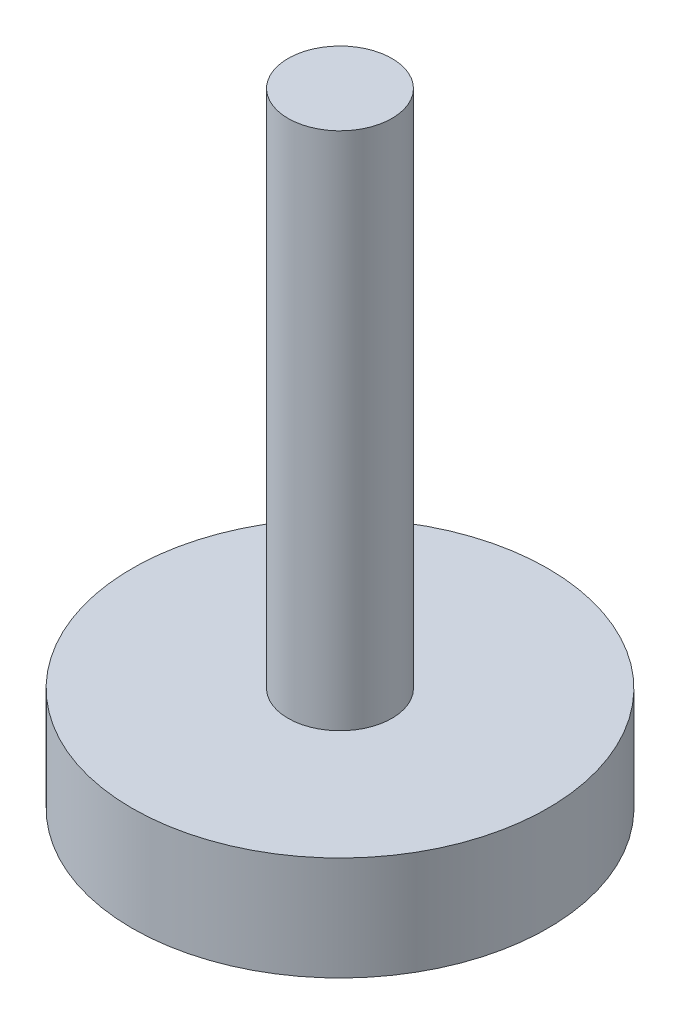
ISO-10303-21;
HEADER;
FILE_DESCRIPTION(('STEP AP214'),'2;1');
FILE_NAME('part.step','',(''),(''),'','','');
FILE_SCHEMA(('AUTOMOTIVE_DESIGN { 1 0 10303 214 1 1 1 1 }'));
ENDSEC;
DATA;
#1=APPLICATION_CONTEXT('core data for automotive mechanical design processes');
#2=APPLICATION_PROTOCOL_DEFINITION('international standard','automotive_design',2000,#1);
#3=PRODUCT_CONTEXT('',#1,'mechanical');
#4=PRODUCT('Part','Part','',(#3));
#5=PRODUCT_RELATED_PRODUCT_CATEGORY('part','',(#4));
#6=PRODUCT_DEFINITION_FORMATION('','',#4);
#7=PRODUCT_DEFINITION_CONTEXT('part definition',#1,'design');
#8=PRODUCT_DEFINITION('design','',#6,#7);
#9=PRODUCT_DEFINITION_SHAPE('','',#8);
#10=(LENGTH_UNIT() NAMED_UNIT(*) SI_UNIT(.MILLI.,.METRE.));
#11=(NAMED_UNIT(*) PLANE_ANGLE_UNIT() SI_UNIT($,.RADIAN.));
#12=(NAMED_UNIT(*) SI_UNIT($,.STERADIAN.) SOLID_ANGLE_UNIT());
#13=UNCERTAINTY_MEASURE_WITH_UNIT(LENGTH_MEASURE(1.E-05),#10,'distance_accuracy_value','');
#14=(GEOMETRIC_REPRESENTATION_CONTEXT(3) GLOBAL_UNCERTAINTY_ASSIGNED_CONTEXT((#13)) GLOBAL_UNIT_ASSIGNED_CONTEXT((#10,
#11,#12)) REPRESENTATION_CONTEXT('',''));
#15=CARTESIAN_POINT('',(0.,0.,0.));
#16=DIRECTION('',(0.,0.,1.));
#17=DIRECTION('',(1.,0.,0.));
#18=AXIS2_PLACEMENT_3D('',#15,#16,#17);
#19=CARTESIAN_POINT('',(0.,2.,0.));
#20=DIRECTION('',(0.,-1.,0.));
#21=DIRECTION('',(0.,0.,-1.));
#22=AXIS2_PLACEMENT_3D('',#19,#20,#21);
#23=CYLINDRICAL_SURFACE('',#22,4.);
#24=CARTESIAN_POINT('',(0.,2.,0.));
#25=DIRECTION('',(0.,1.,0.));
#26=DIRECTION('',(0.,0.,1.));
#27=AXIS2_PLACEMENT_3D('',#24,#25,#26);
#28=CIRCLE('',#27,4.);
#29=CARTESIAN_POINT('',(0.,2.,4.));
#30=VERTEX_POINT('',#29);
#31=EDGE_CURVE('E49',#30,#30,#28,.T.);
#32=ORIENTED_EDGE('',*,*,#31,.F.);
#33=EDGE_LOOP('',(#32));
#34=FACE_BOUND('',#33,.T.);
#35=CARTESIAN_POINT('',(0.,0.,0.));
#36=DIRECTION('',(0.,1.,0.));
#37=DIRECTION('',(0.,0.,1.));
#38=AXIS2_PLACEMENT_3D('',#35,#36,#37);
#39=CIRCLE('',#38,4.);
#40=CARTESIAN_POINT('',(0.,0.,4.));
#41=VERTEX_POINT('',#40);
#42=EDGE_CURVE('E44',#41,#41,#39,.T.);
#43=ORIENTED_EDGE('',*,*,#42,.T.);
#44=EDGE_LOOP('',(#43));
#45=FACE_BOUND('',#44,.T.);
#46=ADVANCED_FACE('F41',(#34,#45),#23,.T.);
#47=CARTESIAN_POINT('',(0.,2.,0.));
#48=DIRECTION('',(0.,1.,0.));
#49=DIRECTION('',(0.,0.,1.));
#50=AXIS2_PLACEMENT_3D('',#47,#48,#49);
#51=PLANE('',#50);
#52=CARTESIAN_POINT('',(0.,2.,0.));
#53=DIRECTION('',(0.,1.,0.));
#54=DIRECTION('',(0.,0.,1.));
#55=AXIS2_PLACEMENT_3D('',#52,#53,#54);
#56=CIRCLE('',#55,1.);
#57=CARTESIAN_POINT('',(0.,2.,1.));
#58=VERTEX_POINT('',#57);
#59=EDGE_CURVE('E10',#58,#58,#56,.T.);
#60=ORIENTED_EDGE('',*,*,#59,.F.);
#61=EDGE_LOOP('',(#60));
#62=FACE_BOUND('',#61,.T.);
#63=ORIENTED_EDGE('',*,*,#31,.T.);
#64=EDGE_LOOP('',(#63));
#65=FACE_BOUND('',#64,.T.);
#66=ADVANCED_FACE('F69',(#62,#65),#51,.T.);
#67=CARTESIAN_POINT('',(0.,0.,0.));
#68=DIRECTION('',(0.,1.,0.));
#69=DIRECTION('',(0.,0.,1.));
#70=AXIS2_PLACEMENT_3D('',#67,#68,#69);
#71=PLANE('',#70);
#72=ORIENTED_EDGE('',*,*,#42,.F.);
#73=EDGE_LOOP('',(#72));
#74=FACE_BOUND('',#73,.T.);
#75=ADVANCED_FACE('F66',(#74),#71,.F.);
#76=CARTESIAN_POINT('',(0.,12.,0.));
#77=DIRECTION('',(0.,-1.,0.));
#78=DIRECTION('',(0.,0.,-1.));
#79=AXIS2_PLACEMENT_3D('',#76,#77,#78);
#80=CYLINDRICAL_SURFACE('',#79,1.);
#81=CARTESIAN_POINT('',(0.,12.,0.));
#82=DIRECTION('',(0.,1.,0.));
#83=DIRECTION('',(0.,0.,1.));
#84=AXIS2_PLACEMENT_3D('',#81,#82,#83);
#85=CIRCLE('',#84,1.);
#86=CARTESIAN_POINT('',(0.,12.,1.));
#87=VERTEX_POINT('',#86);
#88=EDGE_CURVE('E56',#87,#87,#85,.T.);
#89=ORIENTED_EDGE('',*,*,#88,.F.);
#90=EDGE_LOOP('',(#89));
#91=FACE_BOUND('',#90,.T.);
#92=ORIENTED_EDGE('',*,*,#59,.T.);
#93=EDGE_LOOP('',(#92));
#94=FACE_BOUND('',#93,.T.);
#95=ADVANCED_FACE('F68',(#91,#94),#80,.T.);
#96=CARTESIAN_POINT('',(0.,12.,0.));
#97=DIRECTION('',(0.,1.,0.));
#98=DIRECTION('',(0.,0.,1.));
#99=AXIS2_PLACEMENT_3D('',#96,#97,#98);
#100=PLANE('',#99);
#101=ORIENTED_EDGE('',*,*,#88,.T.);
#102=EDGE_LOOP('',(#101));
#103=FACE_BOUND('',#102,.T.);
#104=ADVANCED_FACE('F74',(#103),#100,.T.);
#105=CLOSED_SHELL('',(#46,#66,#75,#95,#104));
#106=MANIFOLD_SOLID_BREP('B2',#105);
#107=ADVANCED_BREP_SHAPE_REPRESENTATION('',(#18,#106),#14);
#108=SHAPE_DEFINITION_REPRESENTATION(#9,#107);
ENDSEC;
END-ISO-10303-21;
